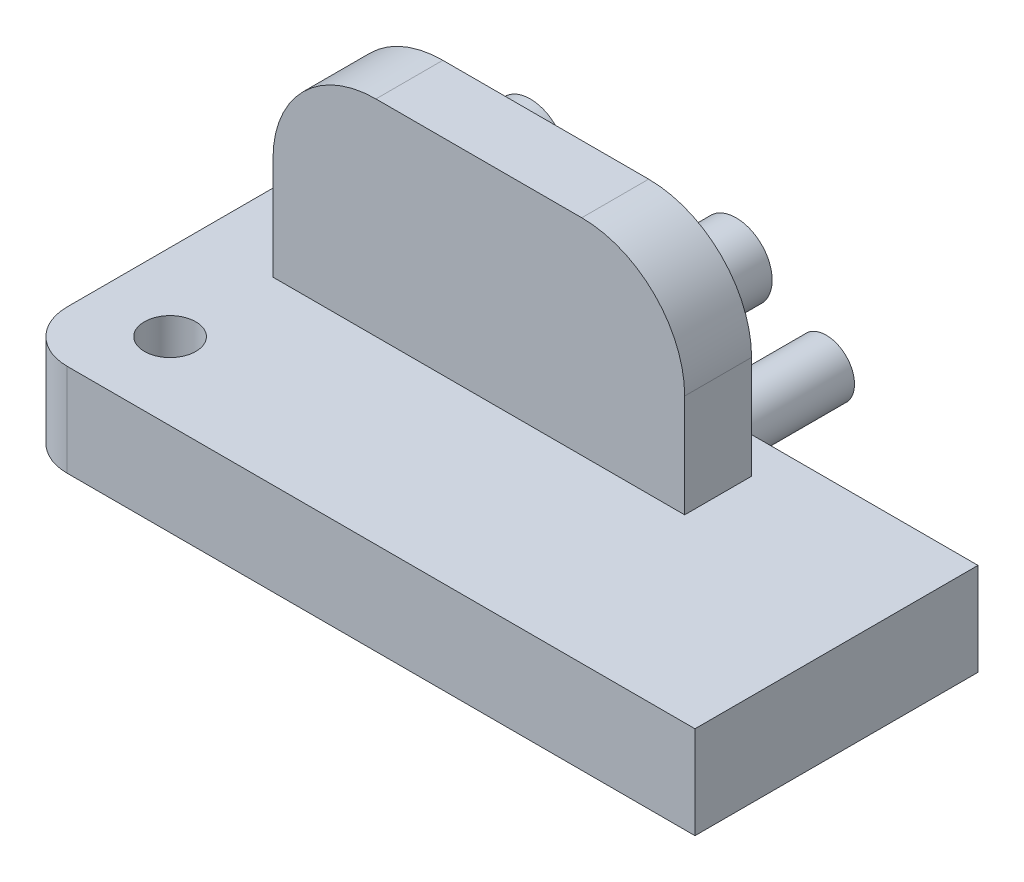
ISO-10303-21;
HEADER;
FILE_DESCRIPTION(('STEP AP214'),'2;1');
FILE_NAME('part.step','',(''),(''),'','','');
FILE_SCHEMA(('AUTOMOTIVE_DESIGN { 1 0 10303 214 1 1 1 1 }'));
ENDSEC;
DATA;
#1=APPLICATION_CONTEXT('core data for automotive mechanical design processes');
#2=APPLICATION_PROTOCOL_DEFINITION('international standard','automotive_design',2000,#1);
#3=PRODUCT_CONTEXT('',#1,'mechanical');
#4=PRODUCT('Part','Part','',(#3));
#5=PRODUCT_RELATED_PRODUCT_CATEGORY('part','',(#4));
#6=PRODUCT_DEFINITION_FORMATION('','',#4);
#7=PRODUCT_DEFINITION_CONTEXT('part definition',#1,'design');
#8=PRODUCT_DEFINITION('design','',#6,#7);
#9=PRODUCT_DEFINITION_SHAPE('','',#8);
#10=(LENGTH_UNIT() NAMED_UNIT(*) SI_UNIT(.MILLI.,.METRE.));
#11=(NAMED_UNIT(*) PLANE_ANGLE_UNIT() SI_UNIT($,.RADIAN.));
#12=(NAMED_UNIT(*) SI_UNIT($,.STERADIAN.) SOLID_ANGLE_UNIT());
#13=UNCERTAINTY_MEASURE_WITH_UNIT(LENGTH_MEASURE(1.E-05),#10,'distance_accuracy_value','');
#14=(GEOMETRIC_REPRESENTATION_CONTEXT(3) GLOBAL_UNCERTAINTY_ASSIGNED_CONTEXT((#13)) GLOBAL_UNIT_ASSIGNED_CONTEXT((#10,
#11,#12)) REPRESENTATION_CONTEXT('',''));
#15=CARTESIAN_POINT('',(0.,0.,0.));
#16=DIRECTION('',(0.,0.,1.));
#17=DIRECTION('',(1.,0.,0.));
#18=AXIS2_PLACEMENT_3D('',#15,#16,#17);
#19=CARTESIAN_POINT('',(50.,8.,-5.));
#20=DIRECTION('',(0.,1.,0.));
#21=DIRECTION('',(0.,0.,1.));
#22=AXIS2_PLACEMENT_3D('',#19,#20,#21);
#23=PLANE('',#22);
#24=DIRECTION('',(0.,0.,-1.));
#25=VECTOR('',#24,1.);
#26=CARTESIAN_POINT('',(7.49999999999999,8.,0.));
#27=LINE('',#26,#25);
#28=CARTESIAN_POINT('',(7.49999999999999,8.,-17.5));
#29=VERTEX_POINT('',#28);
#30=CARTESIAN_POINT('',(7.49999999999999,8.,-24.));
#31=VERTEX_POINT('',#30);
#32=EDGE_CURVE('E178',#29,#31,#27,.T.);
#33=ORIENTED_EDGE('',*,*,#32,.T.);
#34=DIRECTION('',(-1.,0.,0.));
#35=VECTOR('',#34,1.);
#36=CARTESIAN_POINT('',(0.,8.,-24.));
#37=LINE('',#36,#35);
#38=CARTESIAN_POINT('',(47.5,8.,-24.));
#39=VERTEX_POINT('',#38);
#40=EDGE_CURVE('E192',#39,#31,#37,.T.);
#41=ORIENTED_EDGE('',*,*,#40,.F.);
#42=DIRECTION('',(0.,0.,-1.));
#43=VECTOR('',#42,1.);
#44=CARTESIAN_POINT('',(47.5,8.,0.));
#45=LINE('',#44,#43);
#46=CARTESIAN_POINT('',(47.5,8.,-17.5));
#47=VERTEX_POINT('',#46);
#48=EDGE_CURVE('E171',#47,#39,#45,.T.);
#49=ORIENTED_EDGE('',*,*,#48,.F.);
#50=DIRECTION('',(-1.,0.,0.));
#51=VECTOR('',#50,1.);
#52=CARTESIAN_POINT('',(0.,8.,-17.5));
#53=LINE('',#52,#51);
#54=EDGE_CURVE('E194',#47,#29,#53,.T.);
#55=ORIENTED_EDGE('',*,*,#54,.T.);
#56=EDGE_LOOP('',(#33,#41,#49,#55));
#57=FACE_BOUND('',#56,.T.);
#58=DIRECTION('',(0.,0.,1.));
#59=VECTOR('',#58,1.);
#60=CARTESIAN_POINT('',(66.,8.,-27.5));
#61=LINE('',#60,#59);
#62=CARTESIAN_POINT('',(66.,8.,-27.5));
#63=VERTEX_POINT('',#62);
#64=CARTESIAN_POINT('',(66.,8.,0.));
#65=VERTEX_POINT('',#64);
#66=EDGE_CURVE('E147',#63,#65,#61,.T.);
#67=ORIENTED_EDGE('',*,*,#66,.F.);
#68=DIRECTION('',(1.,0.,0.));
#69=VECTOR('',#68,1.);
#70=CARTESIAN_POINT('',(0.,8.,-27.5));
#71=LINE('',#70,#69);
#72=CARTESIAN_POINT('',(0.,8.,-27.5));
#73=VERTEX_POINT('',#72);
#74=EDGE_CURVE('E135',#73,#63,#71,.T.);
#75=ORIENTED_EDGE('',*,*,#74,.F.);
#76=DIRECTION('',(0.,0.,1.));
#77=VECTOR('',#76,1.);
#78=CARTESIAN_POINT('',(0.,8.,-5.00000000000003));
#79=LINE('',#78,#77);
#80=CARTESIAN_POINT('',(0.,8.,-5.00000000000003));
#81=VERTEX_POINT('',#80);
#82=EDGE_CURVE('E207',#73,#81,#79,.T.);
#83=ORIENTED_EDGE('',*,*,#82,.T.);
#84=CARTESIAN_POINT('',(5.,8.,-5.));
#85=DIRECTION('',(0.,1.,0.));
#86=DIRECTION('',(0.,0.,-1.));
#87=AXIS2_PLACEMENT_3D('',#84,#85,#86);
#88=CIRCLE('',#87,5.);
#89=CARTESIAN_POINT('',(5.00000000000003,8.,0.));
#90=VERTEX_POINT('',#89);
#91=EDGE_CURVE('E209',#81,#90,#88,.T.);
#92=ORIENTED_EDGE('',*,*,#91,.T.);
#93=DIRECTION('',(1.,0.,0.));
#94=VECTOR('',#93,1.);
#95=CARTESIAN_POINT('',(5.00000000000003,8.,0.));
#96=LINE('',#95,#94);
#97=EDGE_CURVE('E151',#90,#65,#96,.T.);
#98=ORIENTED_EDGE('',*,*,#97,.T.);
#99=EDGE_LOOP('',(#67,#75,#83,#92,#98));
#100=FACE_BOUND('',#99,.T.);
#101=CARTESIAN_POINT('',(7.50000000000042,8.,-7.5));
#102=DIRECTION('',(0.,1.,0.));
#103=DIRECTION('',(0.,0.,1.));
#104=AXIS2_PLACEMENT_3D('',#101,#102,#103);
#105=CIRCLE('',#104,2.5);
#106=CARTESIAN_POINT('',(7.50000000000042,8.,-5.));
#107=VERTEX_POINT('',#106);
#108=EDGE_CURVE('E204',#107,#107,#105,.T.);
#109=ORIENTED_EDGE('',*,*,#108,.F.);
#110=EDGE_LOOP('',(#109));
#111=FACE_BOUND('',#110,.T.);
#112=ADVANCED_FACE('F49',(#57,#100,#111),#23,.T.);
#113=CARTESIAN_POINT('',(0.,23.,-24.));
#114=DIRECTION('',(0.,0.,1.));
#115=DIRECTION('',(1.,0.,0.));
#116=AXIS2_PLACEMENT_3D('',#113,#114,#115);
#117=PLANE('',#116);
#118=CARTESIAN_POINT('',(17.5,17.,-24.));
#119=DIRECTION('',(0.,0.,1.));
#120=DIRECTION('',(1.,0.,0.));
#121=AXIS2_PLACEMENT_3D('',#118,#119,#120);
#122=CIRCLE('',#121,3.5);
#123=CARTESIAN_POINT('',(21.,17.,-24.));
#124=VERTEX_POINT('',#123);
#125=EDGE_CURVE('E236',#124,#124,#122,.F.);
#126=ORIENTED_EDGE('',*,*,#125,.F.);
#127=EDGE_LOOP('',(#126));
#128=FACE_BOUND('',#127,.T.);
#129=CARTESIAN_POINT('',(37.5,17.,-24.));
#130=DIRECTION('',(0.,0.,1.));
#131=DIRECTION('',(1.,0.,0.));
#132=AXIS2_PLACEMENT_3D('',#129,#130,#131);
#133=CIRCLE('',#132,3.5);
#134=CARTESIAN_POINT('',(41.,17.,-24.));
#135=VERTEX_POINT('',#134);
#136=EDGE_CURVE('E233',#135,#135,#133,.F.);
#137=ORIENTED_EDGE('',*,*,#136,.F.);
#138=EDGE_LOOP('',(#137));
#139=FACE_BOUND('',#138,.T.);
#140=DIRECTION('',(-1.,0.,0.));
#141=VECTOR('',#140,1.);
#142=CARTESIAN_POINT('',(32.,28.,-24.));
#143=LINE('',#142,#141);
#144=CARTESIAN_POINT('',(37.5,28.,-24.));
#145=VERTEX_POINT('',#144);
#146=CARTESIAN_POINT('',(17.5,28.,-24.));
#147=VERTEX_POINT('',#146);
#148=EDGE_CURVE('E186',#145,#147,#143,.T.);
#149=ORIENTED_EDGE('',*,*,#148,.F.);
#150=CARTESIAN_POINT('',(37.5,18.,-24.));
#151=DIRECTION('',(0.,0.,1.));
#152=DIRECTION('',(1.,0.,0.));
#153=AXIS2_PLACEMENT_3D('',#150,#151,#152);
#154=CIRCLE('',#153,10.);
#155=CARTESIAN_POINT('',(47.5,18.,-24.));
#156=VERTEX_POINT('',#155);
#157=EDGE_CURVE('E246',#145,#156,#154,.F.);
#158=ORIENTED_EDGE('',*,*,#157,.T.);
#159=DIRECTION('',(0.,-1.,0.));
#160=VECTOR('',#159,1.);
#161=CARTESIAN_POINT('',(47.5,28.,-24.));
#162=LINE('',#161,#160);
#163=EDGE_CURVE('E176',#156,#39,#162,.T.);
#164=ORIENTED_EDGE('',*,*,#163,.T.);
#165=ORIENTED_EDGE('',*,*,#40,.T.);
#166=DIRECTION('',(0.,-1.,0.));
#167=VECTOR('',#166,1.);
#168=CARTESIAN_POINT('',(7.49999999999999,28.,-24.));
#169=LINE('',#168,#167);
#170=CARTESIAN_POINT('',(7.49999999999999,18.,-24.));
#171=VERTEX_POINT('',#170);
#172=EDGE_CURVE('E181',#171,#31,#169,.T.);
#173=ORIENTED_EDGE('',*,*,#172,.F.);
#174=CARTESIAN_POINT('',(17.5,18.,-24.));
#175=DIRECTION('',(0.,0.,1.));
#176=DIRECTION('',(1.,0.,0.));
#177=AXIS2_PLACEMENT_3D('',#174,#175,#176);
#178=CIRCLE('',#177,10.);
#179=EDGE_CURVE('E244',#171,#147,#178,.F.);
#180=ORIENTED_EDGE('',*,*,#179,.T.);
#181=EDGE_LOOP('',(#149,#158,#164,#165,#173,#180));
#182=FACE_BOUND('',#181,.T.);
#183=ADVANCED_FACE('F260',(#128,#139,#182),#117,.F.);
#184=CARTESIAN_POINT('',(5.00000000000003,-1.,0.));
#185=DIRECTION('',(0.,0.,1.));
#186=DIRECTION('',(1.,0.,0.));
#187=AXIS2_PLACEMENT_3D('',#184,#185,#186);
#188=PLANE('',#187);
#189=DIRECTION('',(1.,0.,0.));
#190=VECTOR('',#189,1.);
#191=CARTESIAN_POINT('',(5.00000000000003,-1.,0.));
#192=LINE('',#191,#190);
#193=CARTESIAN_POINT('',(5.00000000000003,-1.,0.));
#194=VERTEX_POINT('',#193);
#195=CARTESIAN_POINT('',(66.,-1.,0.));
#196=VERTEX_POINT('',#195);
#197=EDGE_CURVE('E220',#194,#196,#192,.T.);
#198=ORIENTED_EDGE('',*,*,#197,.T.);
#199=DIRECTION('',(0.,-1.,0.));
#200=VECTOR('',#199,1.);
#201=CARTESIAN_POINT('',(66.,8.,0.));
#202=LINE('',#201,#200);
#203=EDGE_CURVE('E155',#65,#196,#202,.T.);
#204=ORIENTED_EDGE('',*,*,#203,.F.);
#205=ORIENTED_EDGE('',*,*,#97,.F.);
#206=DIRECTION('',(0.,1.,0.));
#207=VECTOR('',#206,1.);
#208=CARTESIAN_POINT('',(5.00000000000003,-1.,0.));
#209=LINE('',#208,#207);
#210=EDGE_CURVE('E223',#194,#90,#209,.T.);
#211=ORIENTED_EDGE('',*,*,#210,.F.);
#212=EDGE_LOOP('',(#198,#204,#205,#211));
#213=FACE_BOUND('',#212,.T.);
#214=ADVANCED_FACE('F283',(#213),#188,.T.);
#215=CARTESIAN_POINT('',(5.,-1.,-5.));
#216=DIRECTION('',(0.,1.,0.));
#217=DIRECTION('',(0.,0.,1.));
#218=AXIS2_PLACEMENT_3D('',#215,#216,#217);
#219=CYLINDRICAL_SURFACE('',#218,5.);
#220=ORIENTED_EDGE('',*,*,#210,.T.);
#221=ORIENTED_EDGE('',*,*,#91,.F.);
#222=DIRECTION('',(0.,1.,0.));
#223=VECTOR('',#222,1.);
#224=CARTESIAN_POINT('',(0.,-1.,-5.00000000000003));
#225=LINE('',#224,#223);
#226=CARTESIAN_POINT('',(0.,-1.,-5.00000000000003));
#227=VERTEX_POINT('',#226);
#228=EDGE_CURVE('E222',#227,#81,#225,.T.);
#229=ORIENTED_EDGE('',*,*,#228,.F.);
#230=CARTESIAN_POINT('',(5.,-1.,-5.));
#231=DIRECTION('',(0.,1.,0.));
#232=DIRECTION('',(0.,0.,-1.));
#233=AXIS2_PLACEMENT_3D('',#230,#231,#232);
#234=CIRCLE('',#233,5.);
#235=EDGE_CURVE('E217',#227,#194,#234,.T.);
#236=ORIENTED_EDGE('',*,*,#235,.T.);
#237=EDGE_LOOP('',(#220,#221,#229,#236));
#238=FACE_BOUND('',#237,.T.);
#239=ADVANCED_FACE('F300',(#238),#219,.T.);
#240=CARTESIAN_POINT('',(0.,-1.,-5.00000000000003));
#241=DIRECTION('',(-1.,0.,0.));
#242=DIRECTION('',(0.,0.,1.));
#243=AXIS2_PLACEMENT_3D('',#240,#241,#242);
#244=PLANE('',#243);
#245=DIRECTION('',(0.,1.,0.));
#246=VECTOR('',#245,1.);
#247=CARTESIAN_POINT('',(0.,-8.,-27.5));
#248=LINE('',#247,#246);
#249=CARTESIAN_POINT('',(0.,-1.,-27.5));
#250=VERTEX_POINT('',#249);
#251=EDGE_CURVE('E141',#250,#73,#248,.T.);
#252=ORIENTED_EDGE('',*,*,#251,.F.);
#253=DIRECTION('',(0.,0.,1.));
#254=VECTOR('',#253,1.);
#255=CARTESIAN_POINT('',(0.,-1.,-5.00000000000003));
#256=LINE('',#255,#254);
#257=EDGE_CURVE('E215',#250,#227,#256,.T.);
#258=ORIENTED_EDGE('',*,*,#257,.T.);
#259=ORIENTED_EDGE('',*,*,#228,.T.);
#260=ORIENTED_EDGE('',*,*,#82,.F.);
#261=EDGE_LOOP('',(#252,#258,#259,#260));
#262=FACE_BOUND('',#261,.T.);
#263=ADVANCED_FACE('F296',(#262),#244,.T.);
#264=CARTESIAN_POINT('',(50.,-1.,-5.));
#265=DIRECTION('',(0.,1.,0.));
#266=DIRECTION('',(0.,0.,1.));
#267=AXIS2_PLACEMENT_3D('',#264,#265,#266);
#268=PLANE('',#267);
#269=CARTESIAN_POINT('',(7.50000000000042,-1.,-7.5));
#270=DIRECTION('',(0.,1.,0.));
#271=DIRECTION('',(0.,0.,1.));
#272=AXIS2_PLACEMENT_3D('',#269,#270,#271);
#273=CIRCLE('',#272,2.5);
#274=CARTESIAN_POINT('',(7.50000000000042,-1.,-5.));
#275=VERTEX_POINT('',#274);
#276=EDGE_CURVE('E212',#275,#275,#273,.T.);
#277=ORIENTED_EDGE('',*,*,#276,.T.);
#278=EDGE_LOOP('',(#277));
#279=FACE_BOUND('',#278,.T.);
#280=DIRECTION('',(1.,0.,0.));
#281=VECTOR('',#280,1.);
#282=CARTESIAN_POINT('',(50.,-1.,-27.5));
#283=LINE('',#282,#281);
#284=CARTESIAN_POINT('',(66.,-1.,-27.5));
#285=VERTEX_POINT('',#284);
#286=EDGE_CURVE('E202',#250,#285,#283,.T.);
#287=ORIENTED_EDGE('',*,*,#286,.T.);
#288=DIRECTION('',(0.,0.,-1.));
#289=VECTOR('',#288,1.);
#290=CARTESIAN_POINT('',(66.,-1.,-27.5));
#291=LINE('',#290,#289);
#292=EDGE_CURVE('E160',#196,#285,#291,.T.);
#293=ORIENTED_EDGE('',*,*,#292,.F.);
#294=ORIENTED_EDGE('',*,*,#197,.F.);
#295=ORIENTED_EDGE('',*,*,#235,.F.);
#296=ORIENTED_EDGE('',*,*,#257,.F.);
#297=EDGE_LOOP('',(#287,#293,#294,#295,#296));
#298=FACE_BOUND('',#297,.T.);
#299=ADVANCED_FACE('F292',(#279,#298),#268,.F.);
#300=CARTESIAN_POINT('',(7.50000000000042,-1.,-7.5));
#301=DIRECTION('',(0.,1.,0.));
#302=DIRECTION('',(0.,0.,1.));
#303=AXIS2_PLACEMENT_3D('',#300,#301,#302);
#304=CYLINDRICAL_SURFACE('',#303,2.5);
#305=ORIENTED_EDGE('',*,*,#276,.F.);
#306=EDGE_LOOP('',(#305));
#307=FACE_BOUND('',#306,.T.);
#308=ORIENTED_EDGE('',*,*,#108,.T.);
#309=EDGE_LOOP('',(#308));
#310=FACE_BOUND('',#309,.T.);
#311=ADVANCED_FACE('F289',(#307,#310),#304,.F.);
#312=CARTESIAN_POINT('',(0.,-8.,-27.5));
#313=DIRECTION('',(0.,0.,1.));
#314=DIRECTION('',(1.,0.,0.));
#315=AXIS2_PLACEMENT_3D('',#312,#313,#314);
#316=PLANE('',#315);
#317=CARTESIAN_POINT('',(17.5,3.5,-27.5));
#318=DIRECTION('',(0.,0.,1.));
#319=DIRECTION('',(1.,0.,0.));
#320=AXIS2_PLACEMENT_3D('',#317,#318,#319);
#321=CIRCLE('',#320,2.75);
#322=CARTESIAN_POINT('',(20.25,3.5,-27.5));
#323=VERTEX_POINT('',#322);
#324=EDGE_CURVE('E230',#323,#323,#321,.F.);
#325=ORIENTED_EDGE('',*,*,#324,.F.);
#326=EDGE_LOOP('',(#325));
#327=FACE_BOUND('',#326,.T.);
#328=CARTESIAN_POINT('',(37.5,3.5,-27.5));
#329=DIRECTION('',(0.,0.,1.));
#330=DIRECTION('',(1.,0.,0.));
#331=AXIS2_PLACEMENT_3D('',#328,#329,#330);
#332=CIRCLE('',#331,2.75);
#333=CARTESIAN_POINT('',(40.25,3.5,-27.5));
#334=VERTEX_POINT('',#333);
#335=EDGE_CURVE('E225',#334,#334,#332,.F.);
#336=ORIENTED_EDGE('',*,*,#335,.F.);
#337=EDGE_LOOP('',(#336));
#338=FACE_BOUND('',#337,.T.);
#339=ORIENTED_EDGE('',*,*,#74,.T.);
#340=DIRECTION('',(0.,1.,0.));
#341=VECTOR('',#340,1.);
#342=CARTESIAN_POINT('',(66.,8.,-27.5));
#343=LINE('',#342,#341);
#344=EDGE_CURVE('E139',#285,#63,#343,.T.);
#345=ORIENTED_EDGE('',*,*,#344,.F.);
#346=ORIENTED_EDGE('',*,*,#286,.F.);
#347=ORIENTED_EDGE('',*,*,#251,.T.);
#348=EDGE_LOOP('',(#339,#345,#346,#347));
#349=FACE_BOUND('',#348,.T.);
#350=ADVANCED_FACE('F137',(#327,#338,#349),#316,.F.);
#351=CARTESIAN_POINT('',(37.5,3.5,-41.25));
#352=DIRECTION('',(0.,0.,1.));
#353=DIRECTION('',(1.,0.,0.));
#354=AXIS2_PLACEMENT_3D('',#351,#352,#353);
#355=CYLINDRICAL_SURFACE('',#354,2.75);
#356=CARTESIAN_POINT('',(37.5,3.5,-41.25));
#357=DIRECTION('',(0.,0.,-1.));
#358=DIRECTION('',(-1.,0.,0.));
#359=AXIS2_PLACEMENT_3D('',#356,#357,#358);
#360=CIRCLE('',#359,2.75);
#361=CARTESIAN_POINT('',(34.75,3.5,-41.25));
#362=VERTEX_POINT('',#361);
#363=EDGE_CURVE('E144',#362,#362,#360,.T.);
#364=ORIENTED_EDGE('',*,*,#363,.F.);
#365=EDGE_LOOP('',(#364));
#366=FACE_BOUND('',#365,.T.);
#367=ORIENTED_EDGE('',*,*,#335,.T.);
#368=EDGE_LOOP('',(#367));
#369=FACE_BOUND('',#368,.T.);
#370=ADVANCED_FACE('F333',(#366,#369),#355,.T.);
#371=CARTESIAN_POINT('',(37.5,3.5,-41.25));
#372=DIRECTION('',(0.,0.,-1.));
#373=DIRECTION('',(-1.,0.,0.));
#374=AXIS2_PLACEMENT_3D('',#371,#372,#373);
#375=PLANE('',#374);
#376=ORIENTED_EDGE('',*,*,#363,.T.);
#377=EDGE_LOOP('',(#376));
#378=FACE_BOUND('',#377,.T.);
#379=ADVANCED_FACE('F340',(#378),#375,.T.);
#380=CARTESIAN_POINT('',(17.5,3.5,-41.25));
#381=DIRECTION('',(0.,0.,1.));
#382=DIRECTION('',(1.,0.,0.));
#383=AXIS2_PLACEMENT_3D('',#380,#381,#382);
#384=CYLINDRICAL_SURFACE('',#383,2.75);
#385=CARTESIAN_POINT('',(17.5,3.5,-41.25));
#386=DIRECTION('',(0.,0.,-1.));
#387=DIRECTION('',(-1.,0.,0.));
#388=AXIS2_PLACEMENT_3D('',#385,#386,#387);
#389=CIRCLE('',#388,2.75);
#390=CARTESIAN_POINT('',(14.75,3.5,-41.25));
#391=VERTEX_POINT('',#390);
#392=EDGE_CURVE('E196',#391,#391,#389,.T.);
#393=ORIENTED_EDGE('',*,*,#392,.F.);
#394=EDGE_LOOP('',(#393));
#395=FACE_BOUND('',#394,.T.);
#396=ORIENTED_EDGE('',*,*,#324,.T.);
#397=EDGE_LOOP('',(#396));
#398=FACE_BOUND('',#397,.T.);
#399=ADVANCED_FACE('F347',(#395,#398),#384,.T.);
#400=CARTESIAN_POINT('',(17.5,3.5,-41.25));
#401=DIRECTION('',(0.,0.,-1.));
#402=DIRECTION('',(-1.,0.,0.));
#403=AXIS2_PLACEMENT_3D('',#400,#401,#402);
#404=PLANE('',#403);
#405=ORIENTED_EDGE('',*,*,#392,.T.);
#406=EDGE_LOOP('',(#405));
#407=FACE_BOUND('',#406,.T.);
#408=ADVANCED_FACE('F355',(#407),#404,.T.);
#409=CARTESIAN_POINT('',(0.,23.,-17.5));
#410=DIRECTION('',(0.,0.,1.));
#411=DIRECTION('',(1.,0.,0.));
#412=AXIS2_PLACEMENT_3D('',#409,#410,#411);
#413=PLANE('',#412);
#414=DIRECTION('',(0.,-1.,0.));
#415=VECTOR('',#414,1.);
#416=CARTESIAN_POINT('',(47.5,28.,-17.5));
#417=LINE('',#416,#415);
#418=CARTESIAN_POINT('',(47.5,18.,-17.5));
#419=VERTEX_POINT('',#418);
#420=EDGE_CURVE('E174',#419,#47,#417,.T.);
#421=ORIENTED_EDGE('',*,*,#420,.F.);
#422=CARTESIAN_POINT('',(37.5,18.,-17.5));
#423=DIRECTION('',(0.,0.,1.));
#424=DIRECTION('',(1.,0.,0.));
#425=AXIS2_PLACEMENT_3D('',#422,#423,#424);
#426=CIRCLE('',#425,10.);
#427=CARTESIAN_POINT('',(37.5,28.,-17.5));
#428=VERTEX_POINT('',#427);
#429=EDGE_CURVE('E57',#419,#428,#426,.T.);
#430=ORIENTED_EDGE('',*,*,#429,.T.);
#431=DIRECTION('',(1.,0.,0.));
#432=VECTOR('',#431,1.);
#433=CARTESIAN_POINT('',(32.,28.,-17.5));
#434=LINE('',#433,#432);
#435=CARTESIAN_POINT('',(17.5,28.,-17.5));
#436=VERTEX_POINT('',#435);
#437=EDGE_CURVE('E189',#436,#428,#434,.T.);
#438=ORIENTED_EDGE('',*,*,#437,.F.);
#439=CARTESIAN_POINT('',(17.5,18.,-17.5));
#440=DIRECTION('',(0.,0.,1.));
#441=DIRECTION('',(1.,0.,0.));
#442=AXIS2_PLACEMENT_3D('',#439,#440,#441);
#443=CIRCLE('',#442,10.);
#444=CARTESIAN_POINT('',(7.49999999999999,18.,-17.5));
#445=VERTEX_POINT('',#444);
#446=EDGE_CURVE('E64',#436,#445,#443,.T.);
#447=ORIENTED_EDGE('',*,*,#446,.T.);
#448=DIRECTION('',(0.,-1.,0.));
#449=VECTOR('',#448,1.);
#450=CARTESIAN_POINT('',(7.49999999999999,28.,-17.5));
#451=LINE('',#450,#449);
#452=EDGE_CURVE('E184',#445,#29,#451,.T.);
#453=ORIENTED_EDGE('',*,*,#452,.T.);
#454=ORIENTED_EDGE('',*,*,#54,.F.);
#455=EDGE_LOOP('',(#421,#430,#438,#447,#453,#454));
#456=FACE_BOUND('',#455,.T.);
#457=ADVANCED_FACE('F250',(#456),#413,.T.);
#458=CARTESIAN_POINT('',(0.,28.,0.));
#459=DIRECTION('',(0.,-1.,0.));
#460=DIRECTION('',(0.,0.,-1.));
#461=AXIS2_PLACEMENT_3D('',#458,#459,#460);
#462=PLANE('',#461);
#463=ORIENTED_EDGE('',*,*,#437,.T.);
#464=DIRECTION('',(0.,0.,-1.));
#465=VECTOR('',#464,1.);
#466=CARTESIAN_POINT('',(37.5,28.,0.));
#467=LINE('',#466,#465);
#468=EDGE_CURVE('E241',#428,#145,#467,.T.);
#469=ORIENTED_EDGE('',*,*,#468,.T.);
#470=ORIENTED_EDGE('',*,*,#148,.T.);
#471=DIRECTION('',(0.,0.,-1.));
#472=VECTOR('',#471,1.);
#473=CARTESIAN_POINT('',(17.5,28.,-17.5));
#474=LINE('',#473,#472);
#475=EDGE_CURVE('E239',#147,#436,#474,.F.);
#476=ORIENTED_EDGE('',*,*,#475,.T.);
#477=EDGE_LOOP('',(#463,#469,#470,#476));
#478=FACE_BOUND('',#477,.T.);
#479=ADVANCED_FACE('F255',(#478),#462,.F.);
#480=CARTESIAN_POINT('',(7.49999999999999,28.,0.));
#481=DIRECTION('',(-1.,0.,0.));
#482=DIRECTION('',(0.,0.,1.));
#483=AXIS2_PLACEMENT_3D('',#480,#481,#482);
#484=PLANE('',#483);
#485=ORIENTED_EDGE('',*,*,#452,.F.);
#486=DIRECTION('',(0.,0.,-1.));
#487=VECTOR('',#486,1.);
#488=CARTESIAN_POINT('',(7.49999999999999,18.,-24.));
#489=LINE('',#488,#487);
#490=EDGE_CURVE('E12',#445,#171,#489,.T.);
#491=ORIENTED_EDGE('',*,*,#490,.T.);
#492=ORIENTED_EDGE('',*,*,#172,.T.);
#493=ORIENTED_EDGE('',*,*,#32,.F.);
#494=EDGE_LOOP('',(#485,#491,#492,#493));
#495=FACE_BOUND('',#494,.T.);
#496=ADVANCED_FACE('F268',(#495),#484,.T.);
#497=CARTESIAN_POINT('',(47.5,28.,0.));
#498=DIRECTION('',(-1.,0.,0.));
#499=DIRECTION('',(0.,0.,1.));
#500=AXIS2_PLACEMENT_3D('',#497,#498,#499);
#501=PLANE('',#500);
#502=ORIENTED_EDGE('',*,*,#163,.F.);
#503=DIRECTION('',(0.,0.,-1.));
#504=VECTOR('',#503,1.);
#505=CARTESIAN_POINT('',(47.5,18.,0.));
#506=LINE('',#505,#504);
#507=EDGE_CURVE('E72',#156,#419,#506,.F.);
#508=ORIENTED_EDGE('',*,*,#507,.T.);
#509=ORIENTED_EDGE('',*,*,#420,.T.);
#510=ORIENTED_EDGE('',*,*,#48,.T.);
#511=EDGE_LOOP('',(#502,#508,#509,#510));
#512=FACE_BOUND('',#511,.T.);
#513=ADVANCED_FACE('F262',(#512),#501,.F.);
#514=CARTESIAN_POINT('',(37.5,17.,-32.5));
#515=DIRECTION('',(0.,0.,1.));
#516=DIRECTION('',(1.,0.,0.));
#517=AXIS2_PLACEMENT_3D('',#514,#515,#516);
#518=CYLINDRICAL_SURFACE('',#517,3.5);
#519=CARTESIAN_POINT('',(37.5,17.,-32.5));
#520=DIRECTION('',(0.,0.,-1.));
#521=DIRECTION('',(-1.,0.,0.));
#522=AXIS2_PLACEMENT_3D('',#519,#520,#521);
#523=CIRCLE('',#522,3.5);
#524=CARTESIAN_POINT('',(34.,17.,-32.5));
#525=VERTEX_POINT('',#524);
#526=EDGE_CURVE('E168',#525,#525,#523,.T.);
#527=ORIENTED_EDGE('',*,*,#526,.F.);
#528=EDGE_LOOP('',(#527));
#529=FACE_BOUND('',#528,.T.);
#530=ORIENTED_EDGE('',*,*,#136,.T.);
#531=EDGE_LOOP('',(#530));
#532=FACE_BOUND('',#531,.T.);
#533=ADVANCED_FACE('F390',(#529,#532),#518,.T.);
#534=CARTESIAN_POINT('',(0.,0.,-32.5));
#535=DIRECTION('',(0.,0.,-1.));
#536=DIRECTION('',(-1.,0.,0.));
#537=AXIS2_PLACEMENT_3D('',#534,#535,#536);
#538=PLANE('',#537);
#539=ORIENTED_EDGE('',*,*,#526,.T.);
#540=EDGE_LOOP('',(#539));
#541=FACE_BOUND('',#540,.T.);
#542=ADVANCED_FACE('F397',(#541),#538,.T.);
#543=CARTESIAN_POINT('',(17.5,17.,-32.5));
#544=DIRECTION('',(0.,0.,1.));
#545=DIRECTION('',(1.,0.,0.));
#546=AXIS2_PLACEMENT_3D('',#543,#544,#545);
#547=CYLINDRICAL_SURFACE('',#546,3.5);
#548=ORIENTED_EDGE('',*,*,#125,.T.);
#549=EDGE_LOOP('',(#548));
#550=FACE_BOUND('',#549,.T.);
#551=CARTESIAN_POINT('',(17.5,17.,-32.5));
#552=DIRECTION('',(0.,0.,-1.));
#553=DIRECTION('',(-1.,0.,0.));
#554=AXIS2_PLACEMENT_3D('',#551,#552,#553);
#555=CIRCLE('',#554,3.5);
#556=CARTESIAN_POINT('',(14.,17.,-32.5));
#557=VERTEX_POINT('',#556);
#558=EDGE_CURVE('E165',#557,#557,#555,.T.);
#559=ORIENTED_EDGE('',*,*,#558,.F.);
#560=EDGE_LOOP('',(#559));
#561=FACE_BOUND('',#560,.T.);
#562=ADVANCED_FACE('F405',(#550,#561),#547,.T.);
#563=CARTESIAN_POINT('',(0.,0.,-32.5));
#564=DIRECTION('',(0.,0.,-1.));
#565=DIRECTION('',(-1.,0.,0.));
#566=AXIS2_PLACEMENT_3D('',#563,#564,#565);
#567=PLANE('',#566);
#568=ORIENTED_EDGE('',*,*,#558,.T.);
#569=EDGE_LOOP('',(#568));
#570=FACE_BOUND('',#569,.T.);
#571=ADVANCED_FACE('F277',(#570),#567,.T.);
#572=CARTESIAN_POINT('',(37.5,18.,0.));
#573=DIRECTION('',(0.,0.,-1.));
#574=DIRECTION('',(-1.,0.,0.));
#575=AXIS2_PLACEMENT_3D('',#572,#573,#574);
#576=CYLINDRICAL_SURFACE('',#575,10.);
#577=ORIENTED_EDGE('',*,*,#429,.F.);
#578=ORIENTED_EDGE('',*,*,#507,.F.);
#579=ORIENTED_EDGE('',*,*,#157,.F.);
#580=ORIENTED_EDGE('',*,*,#468,.F.);
#581=EDGE_LOOP('',(#577,#578,#579,#580));
#582=FACE_BOUND('',#581,.T.);
#583=ADVANCED_FACE('F258',(#582),#576,.T.);
#584=CARTESIAN_POINT('',(17.5,18.,0.));
#585=DIRECTION('',(0.,0.,1.));
#586=DIRECTION('',(1.,0.,0.));
#587=AXIS2_PLACEMENT_3D('',#584,#585,#586);
#588=CYLINDRICAL_SURFACE('',#587,10.);
#589=ORIENTED_EDGE('',*,*,#446,.F.);
#590=ORIENTED_EDGE('',*,*,#475,.F.);
#591=ORIENTED_EDGE('',*,*,#179,.F.);
#592=ORIENTED_EDGE('',*,*,#490,.F.);
#593=EDGE_LOOP('',(#589,#590,#591,#592));
#594=FACE_BOUND('',#593,.T.);
#595=ADVANCED_FACE('F51',(#594),#588,.T.);
#596=CARTESIAN_POINT('',(66.,0.,0.));
#597=DIRECTION('',(-1.,0.,0.));
#598=DIRECTION('',(0.,0.,1.));
#599=AXIS2_PLACEMENT_3D('',#596,#597,#598);
#600=PLANE('',#599);
#601=ORIENTED_EDGE('',*,*,#344,.T.);
#602=ORIENTED_EDGE('',*,*,#66,.T.);
#603=ORIENTED_EDGE('',*,*,#203,.T.);
#604=ORIENTED_EDGE('',*,*,#292,.T.);
#605=EDGE_LOOP('',(#601,#602,#603,#604));
#606=FACE_BOUND('',#605,.T.);
#607=ADVANCED_FACE('F158',(#606),#600,.F.);
#608=CLOSED_SHELL('',(#112,#183,#214,#239,#263,#299,#311,#350,#370,#379,#399,#408,#457,#479,
#496,#513,#533,#542,#562,#571,#583,#595,#607));
#609=MANIFOLD_SOLID_BREP('B2',#608);
#610=ADVANCED_BREP_SHAPE_REPRESENTATION('',(#18,#609),#14);
#611=SHAPE_DEFINITION_REPRESENTATION(#9,#610);
ENDSEC;
END-ISO-10303-21;
